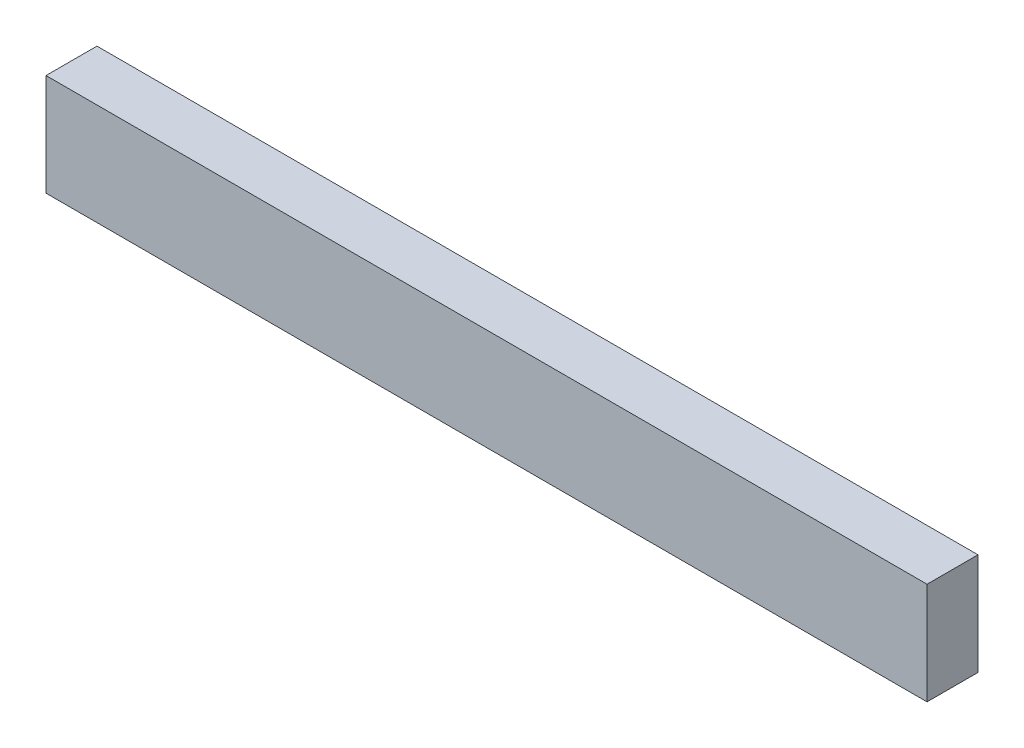
ISO-10303-21;
HEADER;
FILE_DESCRIPTION(('STEP AP214'),'2;1');
FILE_NAME('part.step','',(''),(''),'','','');
FILE_SCHEMA(('AUTOMOTIVE_DESIGN { 1 0 10303 214 1 1 1 1 }'));
ENDSEC;
DATA;
#1=APPLICATION_CONTEXT('core data for automotive mechanical design processes');
#2=APPLICATION_PROTOCOL_DEFINITION('international standard','automotive_design',2000,#1);
#3=PRODUCT_CONTEXT('',#1,'mechanical');
#4=PRODUCT('Part','Part','',(#3));
#5=PRODUCT_RELATED_PRODUCT_CATEGORY('part','',(#4));
#6=PRODUCT_DEFINITION_FORMATION('','',#4);
#7=PRODUCT_DEFINITION_CONTEXT('part definition',#1,'design');
#8=PRODUCT_DEFINITION('design','',#6,#7);
#9=PRODUCT_DEFINITION_SHAPE('','',#8);
#10=(LENGTH_UNIT() NAMED_UNIT(*) SI_UNIT(.MILLI.,.METRE.));
#11=(NAMED_UNIT(*) PLANE_ANGLE_UNIT() SI_UNIT($,.RADIAN.));
#12=(NAMED_UNIT(*) SI_UNIT($,.STERADIAN.) SOLID_ANGLE_UNIT());
#13=UNCERTAINTY_MEASURE_WITH_UNIT(LENGTH_MEASURE(1.E-05),#10,'distance_accuracy_value','');
#14=(GEOMETRIC_REPRESENTATION_CONTEXT(3) GLOBAL_UNCERTAINTY_ASSIGNED_CONTEXT((#13)) GLOBAL_UNIT_ASSIGNED_CONTEXT((#10,
#11,#12)) REPRESENTATION_CONTEXT('',''));
#15=CARTESIAN_POINT('',(0.,0.,0.));
#16=DIRECTION('',(0.,0.,1.));
#17=DIRECTION('',(1.,0.,0.));
#18=AXIS2_PLACEMENT_3D('',#15,#16,#17);
#19=CARTESIAN_POINT('',(207.5,-24.,12.));
#20=DIRECTION('',(-1.,0.,0.));
#21=DIRECTION('',(0.,0.,1.));
#22=AXIS2_PLACEMENT_3D('',#19,#20,#21);
#23=PLANE('',#22);
#24=DIRECTION('',(0.,1.,0.));
#25=VECTOR('',#24,1.);
#26=CARTESIAN_POINT('',(207.5,-24.,-12.));
#27=LINE('',#26,#25);
#28=CARTESIAN_POINT('',(207.5,-24.,-12.));
#29=VERTEX_POINT('',#28);
#30=CARTESIAN_POINT('',(207.5,24.,-12.));
#31=VERTEX_POINT('',#30);
#32=EDGE_CURVE('E112',#29,#31,#27,.T.);
#33=ORIENTED_EDGE('',*,*,#32,.T.);
#34=DIRECTION('',(0.,0.,-1.));
#35=VECTOR('',#34,1.);
#36=CARTESIAN_POINT('',(207.5,23.9999999999998,11.9999999999999));
#37=LINE('',#36,#35);
#38=CARTESIAN_POINT('',(207.5,23.9999999999998,11.9999999999999));
#39=VERTEX_POINT('',#38);
#40=EDGE_CURVE('E11',#39,#31,#37,.T.);
#41=ORIENTED_EDGE('',*,*,#40,.F.);
#42=DIRECTION('',(0.,1.,0.));
#43=VECTOR('',#42,1.);
#44=CARTESIAN_POINT('',(207.5,-24.,12.));
#45=LINE('',#44,#43);
#46=CARTESIAN_POINT('',(207.5,-24.,12.));
#47=VERTEX_POINT('',#46);
#48=EDGE_CURVE('E95',#47,#39,#45,.T.);
#49=ORIENTED_EDGE('',*,*,#48,.F.);
#50=DIRECTION('',(0.,0.,-1.));
#51=VECTOR('',#50,1.);
#52=CARTESIAN_POINT('',(207.5,-24.,12.));
#53=LINE('',#52,#51);
#54=EDGE_CURVE('E108',#47,#29,#53,.T.);
#55=ORIENTED_EDGE('',*,*,#54,.T.);
#56=EDGE_LOOP('',(#33,#41,#49,#55));
#57=FACE_BOUND('',#56,.T.);
#58=ADVANCED_FACE('F43',(#57),#23,.F.);
#59=CARTESIAN_POINT('',(-207.5,24.,12.));
#60=DIRECTION('',(0.,-1.,0.));
#61=DIRECTION('',(0.,0.,-1.));
#62=AXIS2_PLACEMENT_3D('',#59,#60,#61);
#63=PLANE('',#62);
#64=DIRECTION('',(-1.,0.,0.));
#65=VECTOR('',#64,1.);
#66=CARTESIAN_POINT('',(-207.5,24.,-12.));
#67=LINE('',#66,#65);
#68=CARTESIAN_POINT('',(-207.5,24.,-12.));
#69=VERTEX_POINT('',#68);
#70=EDGE_CURVE('E100',#31,#69,#67,.T.);
#71=ORIENTED_EDGE('',*,*,#70,.T.);
#72=DIRECTION('',(0.,0.,-1.));
#73=VECTOR('',#72,1.);
#74=CARTESIAN_POINT('',(-207.5,24.,12.));
#75=LINE('',#74,#73);
#76=CARTESIAN_POINT('',(-207.5,24.,12.));
#77=VERTEX_POINT('',#76);
#78=EDGE_CURVE('E52',#77,#69,#75,.T.);
#79=ORIENTED_EDGE('',*,*,#78,.F.);
#80=DIRECTION('',(-1.,0.,0.));
#81=VECTOR('',#80,1.);
#82=CARTESIAN_POINT('',(-207.5,24.,12.));
#83=LINE('',#82,#81);
#84=EDGE_CURVE('E90',#39,#77,#83,.T.);
#85=ORIENTED_EDGE('',*,*,#84,.F.);
#86=ORIENTED_EDGE('',*,*,#40,.T.);
#87=EDGE_LOOP('',(#71,#79,#85,#86));
#88=FACE_BOUND('',#87,.T.);
#89=ADVANCED_FACE('F99',(#88),#63,.F.);
#90=CARTESIAN_POINT('',(-207.5,-24.,12.));
#91=DIRECTION('',(1.,0.,0.));
#92=DIRECTION('',(0.,0.,-1.));
#93=AXIS2_PLACEMENT_3D('',#90,#91,#92);
#94=PLANE('',#93);
#95=DIRECTION('',(0.,-1.,0.));
#96=VECTOR('',#95,1.);
#97=CARTESIAN_POINT('',(-207.5,-24.,-12.));
#98=LINE('',#97,#96);
#99=CARTESIAN_POINT('',(-207.5,-24.,-12.));
#100=VERTEX_POINT('',#99);
#101=EDGE_CURVE('E77',#69,#100,#98,.T.);
#102=ORIENTED_EDGE('',*,*,#101,.T.);
#103=DIRECTION('',(0.,0.,-1.));
#104=VECTOR('',#103,1.);
#105=CARTESIAN_POINT('',(-207.5,-24.,12.));
#106=LINE('',#105,#104);
#107=CARTESIAN_POINT('',(-207.5,-24.,12.));
#108=VERTEX_POINT('',#107);
#109=EDGE_CURVE('E102',#108,#100,#106,.T.);
#110=ORIENTED_EDGE('',*,*,#109,.F.);
#111=DIRECTION('',(0.,-1.,0.));
#112=VECTOR('',#111,1.);
#113=CARTESIAN_POINT('',(-207.5,-24.,12.));
#114=LINE('',#113,#112);
#115=EDGE_CURVE('E93',#77,#108,#114,.T.);
#116=ORIENTED_EDGE('',*,*,#115,.F.);
#117=ORIENTED_EDGE('',*,*,#78,.T.);
#118=EDGE_LOOP('',(#102,#110,#116,#117));
#119=FACE_BOUND('',#118,.T.);
#120=ADVANCED_FACE('F103',(#119),#94,.F.);
#121=CARTESIAN_POINT('',(-207.5,-24.,12.));
#122=DIRECTION('',(0.,1.,0.));
#123=DIRECTION('',(0.,0.,1.));
#124=AXIS2_PLACEMENT_3D('',#121,#122,#123);
#125=PLANE('',#124);
#126=DIRECTION('',(1.,0.,0.));
#127=VECTOR('',#126,1.);
#128=CARTESIAN_POINT('',(-207.5,-24.,-12.));
#129=LINE('',#128,#127);
#130=EDGE_CURVE('E83',#100,#29,#129,.T.);
#131=ORIENTED_EDGE('',*,*,#130,.T.);
#132=ORIENTED_EDGE('',*,*,#54,.F.);
#133=DIRECTION('',(1.,0.,0.));
#134=VECTOR('',#133,1.);
#135=CARTESIAN_POINT('',(-207.5,-24.,12.));
#136=LINE('',#135,#134);
#137=EDGE_CURVE('E60',#108,#47,#136,.T.);
#138=ORIENTED_EDGE('',*,*,#137,.F.);
#139=ORIENTED_EDGE('',*,*,#109,.T.);
#140=EDGE_LOOP('',(#131,#132,#138,#139));
#141=FACE_BOUND('',#140,.T.);
#142=ADVANCED_FACE('F126',(#141),#125,.F.);
#143=CARTESIAN_POINT('',(0.,0.,12.));
#144=DIRECTION('',(0.,0.,-1.));
#145=DIRECTION('',(-1.,0.,0.));
#146=AXIS2_PLACEMENT_3D('',#143,#144,#145);
#147=PLANE('',#146);
#148=ORIENTED_EDGE('',*,*,#48,.T.);
#149=ORIENTED_EDGE('',*,*,#84,.T.);
#150=ORIENTED_EDGE('',*,*,#115,.T.);
#151=ORIENTED_EDGE('',*,*,#137,.T.);
#152=EDGE_LOOP('',(#148,#149,#150,#151));
#153=FACE_BOUND('',#152,.T.);
#154=ADVANCED_FACE('F91',(#153),#147,.F.);
#155=CARTESIAN_POINT('',(0.,0.,-12.));
#156=DIRECTION('',(0.,0.,-1.));
#157=DIRECTION('',(-1.,0.,0.));
#158=AXIS2_PLACEMENT_3D('',#155,#156,#157);
#159=PLANE('',#158);
#160=ORIENTED_EDGE('',*,*,#32,.F.);
#161=ORIENTED_EDGE('',*,*,#130,.F.);
#162=ORIENTED_EDGE('',*,*,#101,.F.);
#163=ORIENTED_EDGE('',*,*,#70,.F.);
#164=EDGE_LOOP('',(#160,#161,#162,#163));
#165=FACE_BOUND('',#164,.T.);
#166=ADVANCED_FACE('F129',(#165),#159,.T.);
#167=CLOSED_SHELL('',(#58,#89,#120,#142,#154,#166));
#168=MANIFOLD_SOLID_BREP('B2',#167);
#169=ADVANCED_BREP_SHAPE_REPRESENTATION('',(#18,#168),#14);
#170=SHAPE_DEFINITION_REPRESENTATION(#9,#169);
ENDSEC;
END-ISO-10303-21;
